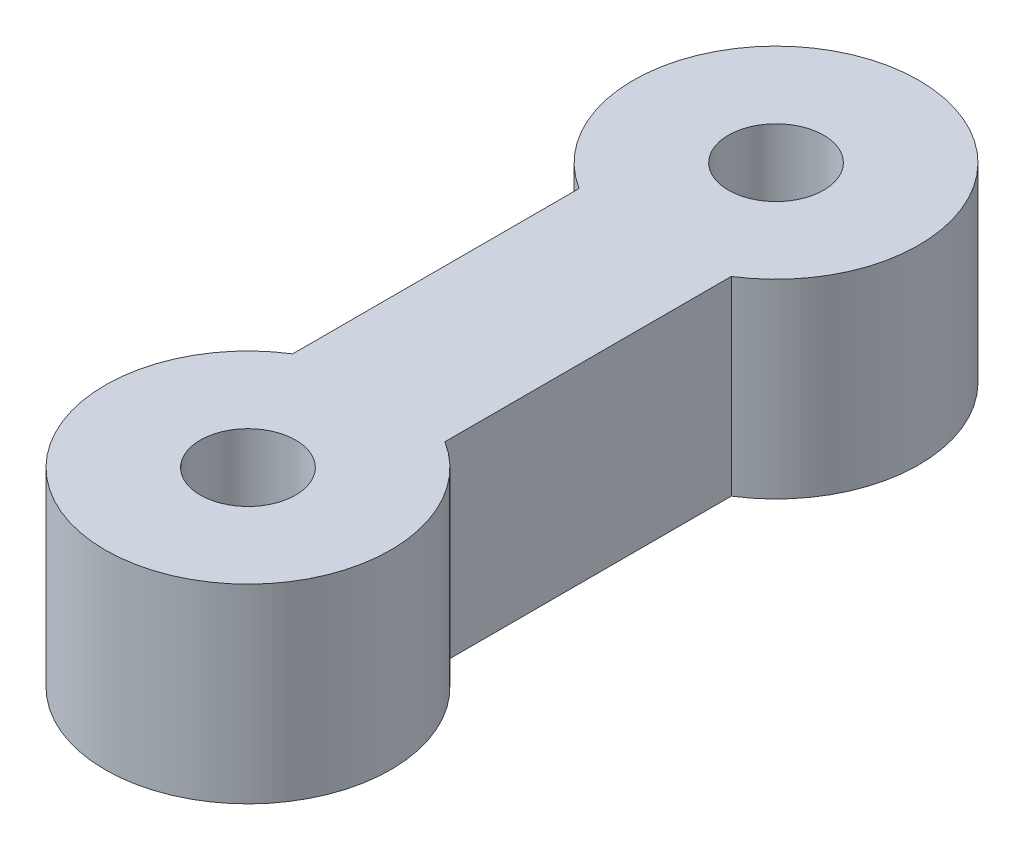
ISO-10303-21;
HEADER;
FILE_DESCRIPTION(('STEP AP214'),'2;1');
FILE_NAME('part.step','',(''),(''),'','','');
FILE_SCHEMA(('AUTOMOTIVE_DESIGN { 1 0 10303 214 1 1 1 1 }'));
ENDSEC;
DATA;
#1=APPLICATION_CONTEXT('core data for automotive mechanical design processes');
#2=APPLICATION_PROTOCOL_DEFINITION('international standard','automotive_design',2000,#1);
#3=PRODUCT_CONTEXT('',#1,'mechanical');
#4=PRODUCT('Part','Part','',(#3));
#5=PRODUCT_RELATED_PRODUCT_CATEGORY('part','',(#4));
#6=PRODUCT_DEFINITION_FORMATION('','',#4);
#7=PRODUCT_DEFINITION_CONTEXT('part definition',#1,'design');
#8=PRODUCT_DEFINITION('design','',#6,#7);
#9=PRODUCT_DEFINITION_SHAPE('','',#8);
#10=(LENGTH_UNIT() NAMED_UNIT(*) SI_UNIT(.MILLI.,.METRE.));
#11=(NAMED_UNIT(*) PLANE_ANGLE_UNIT() SI_UNIT($,.RADIAN.));
#12=(NAMED_UNIT(*) SI_UNIT($,.STERADIAN.) SOLID_ANGLE_UNIT());
#13=UNCERTAINTY_MEASURE_WITH_UNIT(LENGTH_MEASURE(1.E-05),#10,'distance_accuracy_value','');
#14=(GEOMETRIC_REPRESENTATION_CONTEXT(3) GLOBAL_UNCERTAINTY_ASSIGNED_CONTEXT((#13)) GLOBAL_UNIT_ASSIGNED_CONTEXT((#10,
#11,#12)) REPRESENTATION_CONTEXT('',''));
#15=CARTESIAN_POINT('',(0.,0.,0.));
#16=DIRECTION('',(0.,0.,1.));
#17=DIRECTION('',(1.,0.,0.));
#18=AXIS2_PLACEMENT_3D('',#15,#16,#17);
#19=CARTESIAN_POINT('',(0.,10.,0.));
#20=DIRECTION('',(0.,1.,0.));
#21=DIRECTION('',(0.,0.,1.));
#22=AXIS2_PLACEMENT_3D('',#19,#20,#21);
#23=PLANE('',#22);
#24=CARTESIAN_POINT('',(0.,10.,27.75));
#25=DIRECTION('',(0.,1.,0.));
#26=DIRECTION('',(0.,0.,1.));
#27=AXIS2_PLACEMENT_3D('',#24,#25,#26);
#28=CIRCLE('',#27,2.505);
#29=CARTESIAN_POINT('',(0.,10.,30.255));
#30=VERTEX_POINT('',#29);
#31=EDGE_CURVE('E144',#30,#30,#28,.T.);
#32=ORIENTED_EDGE('',*,*,#31,.F.);
#33=EDGE_LOOP('',(#32));
#34=FACE_BOUND('',#33,.T.);
#35=DIRECTION('',(0.,0.,1.));
#36=VECTOR('',#35,1.);
#37=CARTESIAN_POINT('',(-4.,10.,6.));
#38=LINE('',#37,#36);
#39=CARTESIAN_POINT('',(-4.,10.,6.35019881578522));
#40=VERTEX_POINT('',#39);
#41=CARTESIAN_POINT('',(-4.,10.,21.3998011842148));
#42=VERTEX_POINT('',#41);
#43=EDGE_CURVE('E83',#40,#42,#38,.T.);
#44=ORIENTED_EDGE('',*,*,#43,.T.);
#45=CARTESIAN_POINT('',(0.,10.,27.75));
#46=DIRECTION('',(0.,1.,0.));
#47=DIRECTION('',(1.,0.,0.));
#48=AXIS2_PLACEMENT_3D('',#45,#46,#47);
#49=CIRCLE('',#48,7.505);
#50=CARTESIAN_POINT('',(4.,10.,21.3998011842148));
#51=VERTEX_POINT('',#50);
#52=EDGE_CURVE('E149',#42,#51,#49,.T.);
#53=ORIENTED_EDGE('',*,*,#52,.T.);
#54=DIRECTION('',(0.,0.,1.));
#55=VECTOR('',#54,1.);
#56=CARTESIAN_POINT('',(4.,10.,6.));
#57=LINE('',#56,#55);
#58=CARTESIAN_POINT('',(4.,10.,6.35019881578522));
#59=VERTEX_POINT('',#58);
#60=EDGE_CURVE('E60',#59,#51,#57,.T.);
#61=ORIENTED_EDGE('',*,*,#60,.F.);
#62=CARTESIAN_POINT('',(0.,10.,0.));
#63=DIRECTION('',(0.,1.,0.));
#64=DIRECTION('',(1.,0.,0.));
#65=AXIS2_PLACEMENT_3D('',#62,#63,#64);
#66=CIRCLE('',#65,7.505);
#67=EDGE_CURVE('E98',#59,#40,#66,.T.);
#68=ORIENTED_EDGE('',*,*,#67,.T.);
#69=EDGE_LOOP('',(#44,#53,#61,#68));
#70=FACE_BOUND('',#69,.T.);
#71=CARTESIAN_POINT('',(0.,10.,0.));
#72=DIRECTION('',(0.,1.,0.));
#73=DIRECTION('',(0.,0.,1.));
#74=AXIS2_PLACEMENT_3D('',#71,#72,#73);
#75=CIRCLE('',#74,2.505);
#76=CARTESIAN_POINT('',(0.,10.,2.505));
#77=VERTEX_POINT('',#76);
#78=EDGE_CURVE('E104',#77,#77,#75,.T.);
#79=ORIENTED_EDGE('',*,*,#78,.F.);
#80=EDGE_LOOP('',(#79));
#81=FACE_BOUND('',#80,.T.);
#82=ADVANCED_FACE('F45',(#34,#70,#81),#23,.T.);
#83=CARTESIAN_POINT('',(0.,0.,0.));
#84=DIRECTION('',(0.,1.,0.));
#85=DIRECTION('',(0.,0.,1.));
#86=AXIS2_PLACEMENT_3D('',#83,#84,#85);
#87=PLANE('',#86);
#88=DIRECTION('',(0.,0.,1.));
#89=VECTOR('',#88,1.);
#90=CARTESIAN_POINT('',(4.,0.,6.));
#91=LINE('',#90,#89);
#92=CARTESIAN_POINT('',(4.,0.,6.35019881578522));
#93=VERTEX_POINT('',#92);
#94=CARTESIAN_POINT('',(4.,0.,21.3998011842148));
#95=VERTEX_POINT('',#94);
#96=EDGE_CURVE('E113',#93,#95,#91,.T.);
#97=ORIENTED_EDGE('',*,*,#96,.T.);
#98=CARTESIAN_POINT('',(0.,0.,27.75));
#99=DIRECTION('',(0.,1.,0.));
#100=DIRECTION('',(1.,0.,0.));
#101=AXIS2_PLACEMENT_3D('',#98,#99,#100);
#102=CIRCLE('',#101,7.505);
#103=CARTESIAN_POINT('',(-4.,0.,21.3998011842148));
#104=VERTEX_POINT('',#103);
#105=EDGE_CURVE('E115',#104,#95,#102,.T.);
#106=ORIENTED_EDGE('',*,*,#105,.F.);
#107=DIRECTION('',(0.,0.,1.));
#108=VECTOR('',#107,1.);
#109=CARTESIAN_POINT('',(-4.,0.,6.));
#110=LINE('',#109,#108);
#111=CARTESIAN_POINT('',(-4.,0.,6.35019881578522));
#112=VERTEX_POINT('',#111);
#113=EDGE_CURVE('E92',#112,#104,#110,.T.);
#114=ORIENTED_EDGE('',*,*,#113,.F.);
#115=CARTESIAN_POINT('',(0.,0.,0.));
#116=DIRECTION('',(0.,1.,0.));
#117=DIRECTION('',(1.,0.,0.));
#118=AXIS2_PLACEMENT_3D('',#115,#116,#117);
#119=CIRCLE('',#118,7.505);
#120=EDGE_CURVE('E100',#93,#112,#119,.T.);
#121=ORIENTED_EDGE('',*,*,#120,.F.);
#122=EDGE_LOOP('',(#97,#106,#114,#121));
#123=FACE_BOUND('',#122,.T.);
#124=CARTESIAN_POINT('',(0.,0.,0.));
#125=DIRECTION('',(0.,1.,0.));
#126=DIRECTION('',(0.,0.,1.));
#127=AXIS2_PLACEMENT_3D('',#124,#125,#126);
#128=CIRCLE('',#127,2.505);
#129=CARTESIAN_POINT('',(0.,0.,2.505));
#130=VERTEX_POINT('',#129);
#131=EDGE_CURVE('E107',#130,#130,#128,.T.);
#132=ORIENTED_EDGE('',*,*,#131,.T.);
#133=EDGE_LOOP('',(#132));
#134=FACE_BOUND('',#133,.T.);
#135=CARTESIAN_POINT('',(0.,0.,27.75));
#136=DIRECTION('',(0.,1.,0.));
#137=DIRECTION('',(0.,0.,1.));
#138=AXIS2_PLACEMENT_3D('',#135,#136,#137);
#139=CIRCLE('',#138,2.505);
#140=CARTESIAN_POINT('',(0.,0.,30.255));
#141=VERTEX_POINT('',#140);
#142=EDGE_CURVE('E146',#141,#141,#139,.T.);
#143=ORIENTED_EDGE('',*,*,#142,.T.);
#144=EDGE_LOOP('',(#143));
#145=FACE_BOUND('',#144,.T.);
#146=ADVANCED_FACE('F110',(#123,#134,#145),#87,.F.);
#147=CARTESIAN_POINT('',(0.,10.,0.));
#148=DIRECTION('',(0.,-1.,0.));
#149=DIRECTION('',(0.,0.,-1.));
#150=AXIS2_PLACEMENT_3D('',#147,#148,#149);
#151=CYLINDRICAL_SURFACE('',#150,7.505);
#152=ORIENTED_EDGE('',*,*,#67,.F.);
#153=DIRECTION('',(0.,-1.,0.));
#154=VECTOR('',#153,1.);
#155=CARTESIAN_POINT('',(4.,10.,6.35019881578522));
#156=LINE('',#155,#154);
#157=EDGE_CURVE('E53',#59,#93,#156,.T.);
#158=ORIENTED_EDGE('',*,*,#157,.T.);
#159=ORIENTED_EDGE('',*,*,#120,.T.);
#160=DIRECTION('',(0.,-1.,0.));
#161=VECTOR('',#160,1.);
#162=CARTESIAN_POINT('',(-4.,10.,6.35019881578522));
#163=LINE('',#162,#161);
#164=EDGE_CURVE('E86',#112,#40,#163,.F.);
#165=ORIENTED_EDGE('',*,*,#164,.T.);
#166=EDGE_LOOP('',(#152,#158,#159,#165));
#167=FACE_BOUND('',#166,.T.);
#168=ADVANCED_FACE('F47',(#167),#151,.T.);
#169=CARTESIAN_POINT('',(0.,10.,0.));
#170=DIRECTION('',(0.,-1.,0.));
#171=DIRECTION('',(0.,0.,-1.));
#172=AXIS2_PLACEMENT_3D('',#169,#170,#171);
#173=CYLINDRICAL_SURFACE('',#172,2.505);
#174=ORIENTED_EDGE('',*,*,#78,.T.);
#175=EDGE_LOOP('',(#174));
#176=FACE_BOUND('',#175,.T.);
#177=ORIENTED_EDGE('',*,*,#131,.F.);
#178=EDGE_LOOP('',(#177));
#179=FACE_BOUND('',#178,.T.);
#180=ADVANCED_FACE('F127',(#176,#179),#173,.F.);
#181=CARTESIAN_POINT('',(4.,10.,6.));
#182=DIRECTION('',(1.,0.,0.));
#183=DIRECTION('',(0.,0.,-1.));
#184=AXIS2_PLACEMENT_3D('',#181,#182,#183);
#185=PLANE('',#184);
#186=DIRECTION('',(0.,1.,0.));
#187=VECTOR('',#186,1.);
#188=CARTESIAN_POINT('',(4.,0.,21.3998011842148));
#189=LINE('',#188,#187);
#190=EDGE_CURVE('E64',#95,#51,#189,.T.);
#191=ORIENTED_EDGE('',*,*,#190,.F.);
#192=ORIENTED_EDGE('',*,*,#96,.F.);
#193=ORIENTED_EDGE('',*,*,#157,.F.);
#194=ORIENTED_EDGE('',*,*,#60,.T.);
#195=EDGE_LOOP('',(#191,#192,#193,#194));
#196=FACE_BOUND('',#195,.T.);
#197=ADVANCED_FACE('F129',(#196),#185,.T.);
#198=CARTESIAN_POINT('',(-4.,10.,6.));
#199=DIRECTION('',(-1.,0.,0.));
#200=DIRECTION('',(0.,-1.,0.));
#201=AXIS2_PLACEMENT_3D('',#198,#199,#200);
#202=PLANE('',#201);
#203=DIRECTION('',(0.,1.,0.));
#204=VECTOR('',#203,1.);
#205=CARTESIAN_POINT('',(-4.,0.,21.3998011842148));
#206=LINE('',#205,#204);
#207=EDGE_CURVE('E12',#42,#104,#206,.F.);
#208=ORIENTED_EDGE('',*,*,#207,.F.);
#209=ORIENTED_EDGE('',*,*,#43,.F.);
#210=ORIENTED_EDGE('',*,*,#164,.F.);
#211=ORIENTED_EDGE('',*,*,#113,.T.);
#212=EDGE_LOOP('',(#208,#209,#210,#211));
#213=FACE_BOUND('',#212,.T.);
#214=ADVANCED_FACE('F85',(#213),#202,.T.);
#215=CARTESIAN_POINT('',(0.,0.,27.75));
#216=DIRECTION('',(0.,1.,0.));
#217=DIRECTION('',(0.,0.,1.));
#218=AXIS2_PLACEMENT_3D('',#215,#216,#217);
#219=CYLINDRICAL_SURFACE('',#218,2.505);
#220=ORIENTED_EDGE('',*,*,#31,.T.);
#221=EDGE_LOOP('',(#220));
#222=FACE_BOUND('',#221,.T.);
#223=ORIENTED_EDGE('',*,*,#142,.F.);
#224=EDGE_LOOP('',(#223));
#225=FACE_BOUND('',#224,.T.);
#226=ADVANCED_FACE('F156',(#222,#225),#219,.F.);
#227=CARTESIAN_POINT('',(0.,0.,27.75));
#228=DIRECTION('',(0.,1.,0.));
#229=DIRECTION('',(0.,0.,1.));
#230=AXIS2_PLACEMENT_3D('',#227,#228,#229);
#231=CYLINDRICAL_SURFACE('',#230,7.505);
#232=ORIENTED_EDGE('',*,*,#105,.T.);
#233=ORIENTED_EDGE('',*,*,#190,.T.);
#234=ORIENTED_EDGE('',*,*,#52,.F.);
#235=ORIENTED_EDGE('',*,*,#207,.T.);
#236=EDGE_LOOP('',(#232,#233,#234,#235));
#237=FACE_BOUND('',#236,.T.);
#238=ADVANCED_FACE('F154',(#237),#231,.T.);
#239=CLOSED_SHELL('',(#82,#146,#168,#180,#197,#214,#226,#238));
#240=MANIFOLD_SOLID_BREP('B2',#239);
#241=ADVANCED_BREP_SHAPE_REPRESENTATION('',(#18,#240),#14);
#242=SHAPE_DEFINITION_REPRESENTATION(#9,#241);
ENDSEC;
END-ISO-10303-21;
